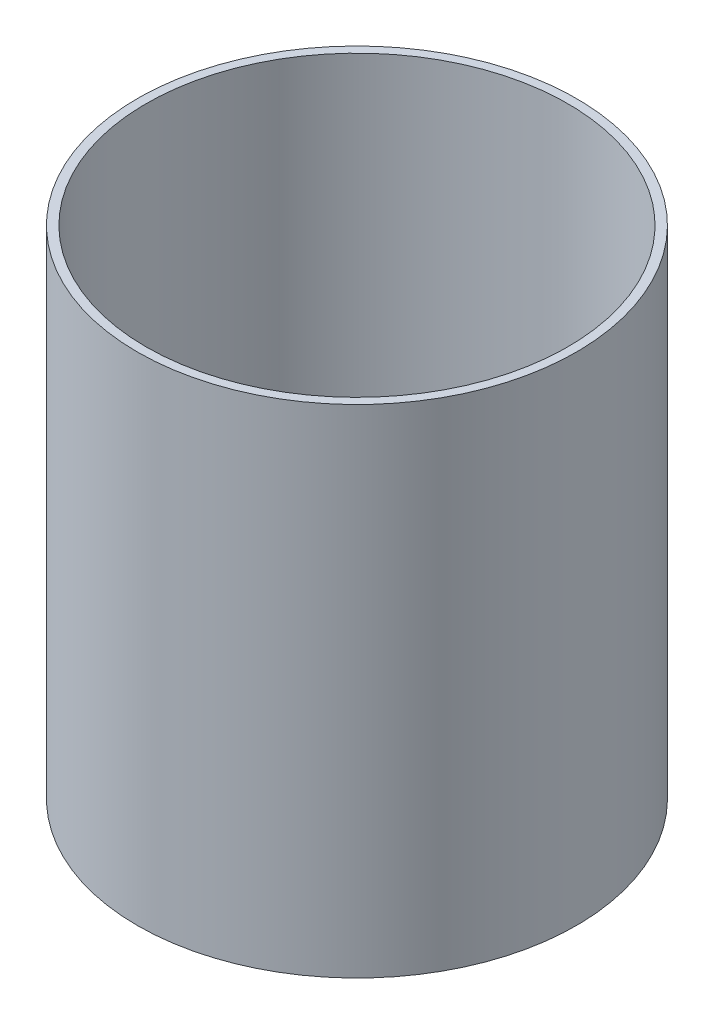
ISO-10303-21;
HEADER;
FILE_DESCRIPTION(('STEP AP214'),'2;1');
FILE_NAME('part.step','',(''),(''),'','','');
FILE_SCHEMA(('AUTOMOTIVE_DESIGN { 1 0 10303 214 1 1 1 1 }'));
ENDSEC;
DATA;
#1=APPLICATION_CONTEXT('core data for automotive mechanical design processes');
#2=APPLICATION_PROTOCOL_DEFINITION('international standard','automotive_design',2000,#1);
#3=PRODUCT_CONTEXT('',#1,'mechanical');
#4=PRODUCT('Part','Part','',(#3));
#5=PRODUCT_RELATED_PRODUCT_CATEGORY('part','',(#4));
#6=PRODUCT_DEFINITION_FORMATION('','',#4);
#7=PRODUCT_DEFINITION_CONTEXT('part definition',#1,'design');
#8=PRODUCT_DEFINITION('design','',#6,#7);
#9=PRODUCT_DEFINITION_SHAPE('','',#8);
#10=(LENGTH_UNIT() NAMED_UNIT(*) SI_UNIT(.MILLI.,.METRE.));
#11=(NAMED_UNIT(*) PLANE_ANGLE_UNIT() SI_UNIT($,.RADIAN.));
#12=(NAMED_UNIT(*) SI_UNIT($,.STERADIAN.) SOLID_ANGLE_UNIT());
#13=UNCERTAINTY_MEASURE_WITH_UNIT(LENGTH_MEASURE(1.E-05),#10,'distance_accuracy_value','');
#14=(GEOMETRIC_REPRESENTATION_CONTEXT(3) GLOBAL_UNCERTAINTY_ASSIGNED_CONTEXT((#13)) GLOBAL_UNIT_ASSIGNED_CONTEXT((#10,
#11,#12)) REPRESENTATION_CONTEXT('',''));
#15=CARTESIAN_POINT('',(0.,0.,0.));
#16=DIRECTION('',(0.,0.,1.));
#17=DIRECTION('',(1.,0.,0.));
#18=AXIS2_PLACEMENT_3D('',#15,#16,#17);
#19=CARTESIAN_POINT('',(13.4500026897194,57.5,-24.2902758126481));
#20=DIRECTION('',(0.,1.,0.));
#21=DIRECTION('',(0.,0.,1.));
#22=AXIS2_PLACEMENT_3D('',#19,#20,#21);
#23=PLANE('',#22);
#24=CARTESIAN_POINT('',(13.4500026897194,57.5,-24.2902758126481));
#25=DIRECTION('',(0.,1.,0.));
#26=DIRECTION('',(0.,0.,1.));
#27=AXIS2_PLACEMENT_3D('',#24,#25,#26);
#28=CIRCLE('',#27,25.417);
#29=CARTESIAN_POINT('',(13.4500026897194,57.5,1.12672418735193));
#30=VERTEX_POINT('',#29);
#31=EDGE_CURVE('E10',#30,#30,#28,.T.);
#32=ORIENTED_EDGE('',*,*,#31,.T.);
#33=EDGE_LOOP('',(#32));
#34=FACE_BOUND('',#33,.T.);
#35=CARTESIAN_POINT('',(13.4500026897194,57.5,-24.2902758126481));
#36=DIRECTION('',(0.,1.,0.));
#37=DIRECTION('',(0.,0.,1.));
#38=AXIS2_PLACEMENT_3D('',#35,#36,#37);
#39=CIRCLE('',#38,24.401);
#40=CARTESIAN_POINT('',(13.4500026897194,57.5,0.110724187351936));
#41=VERTEX_POINT('',#40);
#42=EDGE_CURVE('E41',#41,#41,#39,.T.);
#43=ORIENTED_EDGE('',*,*,#42,.F.);
#44=EDGE_LOOP('',(#43));
#45=FACE_BOUND('',#44,.T.);
#46=ADVANCED_FACE('F30',(#34,#45),#23,.T.);
#47=CARTESIAN_POINT('',(13.4500026897194,0.,-24.2902758126481));
#48=DIRECTION('',(0.,1.,0.));
#49=DIRECTION('',(0.,0.,1.));
#50=AXIS2_PLACEMENT_3D('',#47,#48,#49);
#51=PLANE('',#50);
#52=CARTESIAN_POINT('',(13.4500026897194,0.,-24.2902758126481));
#53=DIRECTION('',(0.,1.,0.));
#54=DIRECTION('',(0.,0.,1.));
#55=AXIS2_PLACEMENT_3D('',#52,#53,#54);
#56=CIRCLE('',#55,25.417);
#57=CARTESIAN_POINT('',(13.4500026897194,0.,1.12672418735193));
#58=VERTEX_POINT('',#57);
#59=EDGE_CURVE('E34',#58,#58,#56,.T.);
#60=ORIENTED_EDGE('',*,*,#59,.F.);
#61=EDGE_LOOP('',(#60));
#62=FACE_BOUND('',#61,.T.);
#63=CARTESIAN_POINT('',(13.4500026897194,0.,-24.2902758126481));
#64=DIRECTION('',(0.,1.,0.));
#65=DIRECTION('',(0.,0.,1.));
#66=AXIS2_PLACEMENT_3D('',#63,#64,#65);
#67=CIRCLE('',#66,24.401);
#68=CARTESIAN_POINT('',(13.4500026897194,0.,0.110724187351936));
#69=VERTEX_POINT('',#68);
#70=EDGE_CURVE('E43',#69,#69,#67,.T.);
#71=ORIENTED_EDGE('',*,*,#70,.T.);
#72=EDGE_LOOP('',(#71));
#73=FACE_BOUND('',#72,.T.);
#74=ADVANCED_FACE('F53',(#62,#73),#51,.F.);
#75=CARTESIAN_POINT('',(13.4500026897194,57.5,-24.2902758126481));
#76=DIRECTION('',(0.,-1.,0.));
#77=DIRECTION('',(0.,0.,-1.));
#78=AXIS2_PLACEMENT_3D('',#75,#76,#77);
#79=CYLINDRICAL_SURFACE('',#78,25.417);
#80=ORIENTED_EDGE('',*,*,#31,.F.);
#81=EDGE_LOOP('',(#80));
#82=FACE_BOUND('',#81,.T.);
#83=ORIENTED_EDGE('',*,*,#59,.T.);
#84=EDGE_LOOP('',(#83));
#85=FACE_BOUND('',#84,.T.);
#86=ADVANCED_FACE('F32',(#82,#85),#79,.T.);
#87=CARTESIAN_POINT('',(13.4500026897194,57.5,-24.2902758126481));
#88=DIRECTION('',(0.,-1.,0.));
#89=DIRECTION('',(0.,0.,-1.));
#90=AXIS2_PLACEMENT_3D('',#87,#88,#89);
#91=CYLINDRICAL_SURFACE('',#90,24.401);
#92=ORIENTED_EDGE('',*,*,#42,.T.);
#93=EDGE_LOOP('',(#92));
#94=FACE_BOUND('',#93,.T.);
#95=ORIENTED_EDGE('',*,*,#70,.F.);
#96=EDGE_LOOP('',(#95));
#97=FACE_BOUND('',#96,.T.);
#98=ADVANCED_FACE('F49',(#94,#97),#91,.F.);
#99=CLOSED_SHELL('',(#46,#74,#86,#98));
#100=MANIFOLD_SOLID_BREP('B2',#99);
#101=ADVANCED_BREP_SHAPE_REPRESENTATION('',(#18,#100),#14);
#102=SHAPE_DEFINITION_REPRESENTATION(#9,#101);
ENDSEC;
END-ISO-10303-21;
